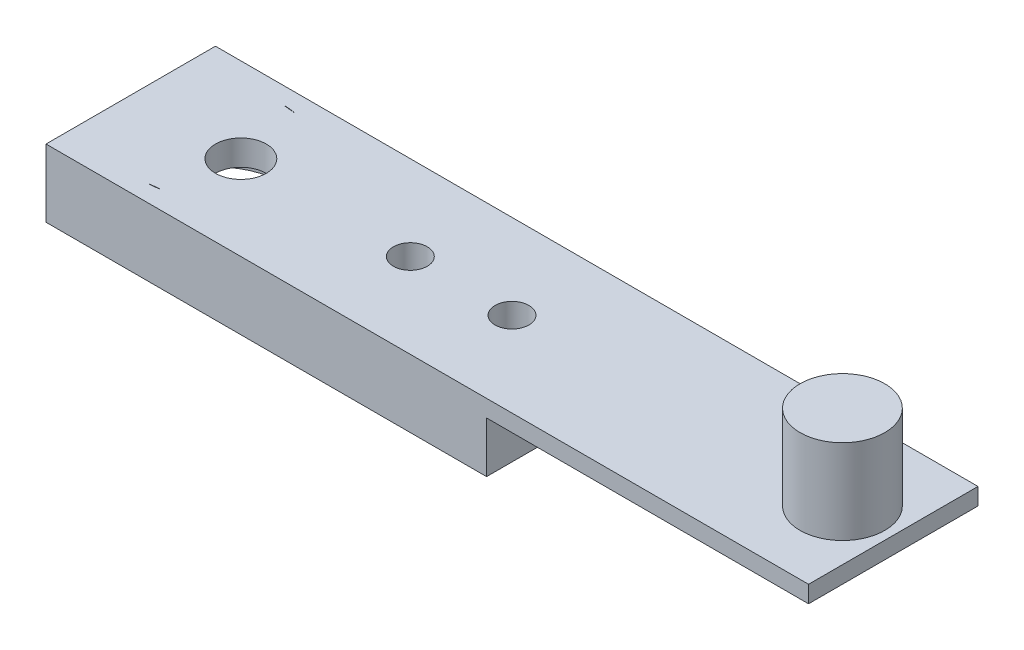
ISO-10303-21;
HEADER;
FILE_DESCRIPTION(('STEP AP214'),'2;1');
FILE_NAME('part.step','',(''),(''),'','','');
FILE_SCHEMA(('AUTOMOTIVE_DESIGN { 1 0 10303 214 1 1 1 1 }'));
ENDSEC;
DATA;
#1=APPLICATION_CONTEXT('core data for automotive mechanical design processes');
#2=APPLICATION_PROTOCOL_DEFINITION('international standard','automotive_design',2000,#1);
#3=PRODUCT_CONTEXT('',#1,'mechanical');
#4=PRODUCT('Part','Part','',(#3));
#5=PRODUCT_RELATED_PRODUCT_CATEGORY('part','',(#4));
#6=PRODUCT_DEFINITION_FORMATION('','',#4);
#7=PRODUCT_DEFINITION_CONTEXT('part definition',#1,'design');
#8=PRODUCT_DEFINITION('design','',#6,#7);
#9=PRODUCT_DEFINITION_SHAPE('','',#8);
#10=(LENGTH_UNIT() NAMED_UNIT(*) SI_UNIT(.MILLI.,.METRE.));
#11=(NAMED_UNIT(*) PLANE_ANGLE_UNIT() SI_UNIT($,.RADIAN.));
#12=(NAMED_UNIT(*) SI_UNIT($,.STERADIAN.) SOLID_ANGLE_UNIT());
#13=UNCERTAINTY_MEASURE_WITH_UNIT(LENGTH_MEASURE(1.E-05),#10,'distance_accuracy_value','');
#14=(GEOMETRIC_REPRESENTATION_CONTEXT(3) GLOBAL_UNCERTAINTY_ASSIGNED_CONTEXT((#13)) GLOBAL_UNIT_ASSIGNED_CONTEXT((#10,
#11,#12)) REPRESENTATION_CONTEXT('',''));
#15=CARTESIAN_POINT('',(0.,0.,0.));
#16=DIRECTION('',(0.,0.,1.));
#17=DIRECTION('',(1.,0.,0.));
#18=AXIS2_PLACEMENT_3D('',#15,#16,#17);
#19=CARTESIAN_POINT('',(42.,3.,-5.00000000000001));
#20=DIRECTION('',(0.,1.,0.));
#21=DIRECTION('',(0.,0.,1.));
#22=AXIS2_PLACEMENT_3D('',#19,#20,#21);
#23=CYLINDRICAL_SURFACE('',#22,2.5);
#24=CARTESIAN_POINT('',(42.,9.,-5.00000000000001));
#25=DIRECTION('',(0.,1.,0.));
#26=DIRECTION('',(0.,0.,1.));
#27=AXIS2_PLACEMENT_3D('',#24,#25,#26);
#28=CIRCLE('',#27,2.5);
#29=CARTESIAN_POINT('',(42.,9.,-2.5));
#30=VERTEX_POINT('',#29);
#31=EDGE_CURVE('E12',#30,#30,#28,.T.);
#32=ORIENTED_EDGE('',*,*,#31,.F.);
#33=EDGE_LOOP('',(#32));
#34=FACE_BOUND('',#33,.T.);
#35=CARTESIAN_POINT('',(42.,4.,-5.00000000000001));
#36=DIRECTION('',(0.,1.,0.));
#37=DIRECTION('',(0.,0.,1.));
#38=AXIS2_PLACEMENT_3D('',#35,#36,#37);
#39=CIRCLE('',#38,2.5);
#40=CARTESIAN_POINT('',(42.,4.,-2.5));
#41=VERTEX_POINT('',#40);
#42=EDGE_CURVE('E124',#41,#41,#39,.T.);
#43=ORIENTED_EDGE('',*,*,#42,.T.);
#44=EDGE_LOOP('',(#43));
#45=FACE_BOUND('',#44,.T.);
#46=ADVANCED_FACE('F54',(#34,#45),#23,.T.);
#47=CARTESIAN_POINT('',(42.,9.,-5.00000000000001));
#48=DIRECTION('',(0.,1.,0.));
#49=DIRECTION('',(0.,0.,1.));
#50=AXIS2_PLACEMENT_3D('',#47,#48,#49);
#51=PLANE('',#50);
#52=ORIENTED_EDGE('',*,*,#31,.T.);
#53=EDGE_LOOP('',(#52));
#54=FACE_BOUND('',#53,.T.);
#55=ADVANCED_FACE('F277',(#54),#51,.T.);
#56=CARTESIAN_POINT('',(45.,3.,0.));
#57=DIRECTION('',(-1.,0.,0.));
#58=DIRECTION('',(0.,0.,1.));
#59=AXIS2_PLACEMENT_3D('',#56,#57,#58);
#60=PLANE('',#59);
#61=DIRECTION('',(0.,0.,1.));
#62=VECTOR('',#61,1.);
#63=CARTESIAN_POINT('',(45.,4.,0.));
#64=LINE('',#63,#62);
#65=CARTESIAN_POINT('',(45.,4.,-10.));
#66=VERTEX_POINT('',#65);
#67=CARTESIAN_POINT('',(45.,4.,0.));
#68=VERTEX_POINT('',#67);
#69=EDGE_CURVE('E117',#66,#68,#64,.T.);
#70=ORIENTED_EDGE('',*,*,#69,.T.);
#71=DIRECTION('',(0.,1.,0.));
#72=VECTOR('',#71,1.);
#73=CARTESIAN_POINT('',(45.,3.,0.));
#74=LINE('',#73,#72);
#75=CARTESIAN_POINT('',(45.,3.,0.));
#76=VERTEX_POINT('',#75);
#77=EDGE_CURVE('E62',#76,#68,#74,.T.);
#78=ORIENTED_EDGE('',*,*,#77,.F.);
#79=DIRECTION('',(0.,0.,1.));
#80=VECTOR('',#79,1.);
#81=CARTESIAN_POINT('',(45.,3.,0.));
#82=LINE('',#81,#80);
#83=CARTESIAN_POINT('',(45.,3.,-10.));
#84=VERTEX_POINT('',#83);
#85=EDGE_CURVE('E108',#84,#76,#82,.T.);
#86=ORIENTED_EDGE('',*,*,#85,.F.);
#87=DIRECTION('',(0.,1.,0.));
#88=VECTOR('',#87,1.);
#89=CARTESIAN_POINT('',(45.,3.,-10.));
#90=LINE('',#89,#88);
#91=EDGE_CURVE('E70',#84,#66,#90,.T.);
#92=ORIENTED_EDGE('',*,*,#91,.T.);
#93=EDGE_LOOP('',(#70,#78,#86,#92));
#94=FACE_BOUND('',#93,.T.);
#95=ADVANCED_FACE('F116',(#94),#60,.F.);
#96=CARTESIAN_POINT('',(0.,3.,0.));
#97=DIRECTION('',(0.,0.,-1.));
#98=DIRECTION('',(-1.,0.,0.));
#99=AXIS2_PLACEMENT_3D('',#96,#97,#98);
#100=PLANE('',#99);
#101=DIRECTION('',(-1.,0.,0.));
#102=VECTOR('',#101,1.);
#103=CARTESIAN_POINT('',(0.,4.,0.));
#104=LINE('',#103,#102);
#105=CARTESIAN_POINT('',(0.,4.,0.));
#106=VERTEX_POINT('',#105);
#107=EDGE_CURVE('E83',#68,#106,#104,.T.);
#108=ORIENTED_EDGE('',*,*,#107,.T.);
#109=DIRECTION('',(0.,-1.,0.));
#110=VECTOR('',#109,1.);
#111=CARTESIAN_POINT('',(0.,4.,0.));
#112=LINE('',#111,#110);
#113=CARTESIAN_POINT('',(0.,0.,0.));
#114=VERTEX_POINT('',#113);
#115=EDGE_CURVE('E148',#106,#114,#112,.T.);
#116=ORIENTED_EDGE('',*,*,#115,.T.);
#117=DIRECTION('',(1.,0.,0.));
#118=VECTOR('',#117,1.);
#119=CARTESIAN_POINT('',(0.,0.,0.));
#120=LINE('',#119,#118);
#121=CARTESIAN_POINT('',(26.,0.,0.));
#122=VERTEX_POINT('',#121);
#123=EDGE_CURVE('E152',#114,#122,#120,.T.);
#124=ORIENTED_EDGE('',*,*,#123,.T.);
#125=DIRECTION('',(0.,-1.,0.));
#126=VECTOR('',#125,1.);
#127=CARTESIAN_POINT('',(26.,4.,0.));
#128=LINE('',#127,#126);
#129=CARTESIAN_POINT('',(26.,3.,0.));
#130=VERTEX_POINT('',#129);
#131=EDGE_CURVE('E106',#130,#122,#128,.T.);
#132=ORIENTED_EDGE('',*,*,#131,.F.);
#133=DIRECTION('',(-1.,0.,0.));
#134=VECTOR('',#133,1.);
#135=CARTESIAN_POINT('',(0.,3.,0.));
#136=LINE('',#135,#134);
#137=EDGE_CURVE('E100',#76,#130,#136,.T.);
#138=ORIENTED_EDGE('',*,*,#137,.F.);
#139=ORIENTED_EDGE('',*,*,#77,.T.);
#140=EDGE_LOOP('',(#108,#116,#124,#132,#138,#139));
#141=FACE_BOUND('',#140,.T.);
#142=ADVANCED_FACE('F102',(#141),#100,.F.);
#143=CARTESIAN_POINT('',(0.,3.,-10.));
#144=DIRECTION('',(0.,0.,-1.));
#145=DIRECTION('',(-1.,0.,0.));
#146=AXIS2_PLACEMENT_3D('',#143,#144,#145);
#147=PLANE('',#146);
#148=DIRECTION('',(-1.,0.,0.));
#149=VECTOR('',#148,1.);
#150=CARTESIAN_POINT('',(0.,4.,-10.));
#151=LINE('',#150,#149);
#152=CARTESIAN_POINT('',(0.,4.,-10.));
#153=VERTEX_POINT('',#152);
#154=EDGE_CURVE('E114',#66,#153,#151,.T.);
#155=ORIENTED_EDGE('',*,*,#154,.F.);
#156=ORIENTED_EDGE('',*,*,#91,.F.);
#157=DIRECTION('',(-1.,0.,0.));
#158=VECTOR('',#157,1.);
#159=CARTESIAN_POINT('',(0.,3.,-10.));
#160=LINE('',#159,#158);
#161=CARTESIAN_POINT('',(26.,3.,-10.));
#162=VERTEX_POINT('',#161);
#163=EDGE_CURVE('E112',#84,#162,#160,.T.);
#164=ORIENTED_EDGE('',*,*,#163,.T.);
#165=DIRECTION('',(0.,-1.,0.));
#166=VECTOR('',#165,1.);
#167=CARTESIAN_POINT('',(26.,4.,-10.));
#168=LINE('',#167,#166);
#169=CARTESIAN_POINT('',(26.,0.,-10.));
#170=VERTEX_POINT('',#169);
#171=EDGE_CURVE('E129',#162,#170,#168,.T.);
#172=ORIENTED_EDGE('',*,*,#171,.T.);
#173=DIRECTION('',(1.,0.,0.));
#174=VECTOR('',#173,1.);
#175=CARTESIAN_POINT('',(0.,0.,-10.));
#176=LINE('',#175,#174);
#177=CARTESIAN_POINT('',(0.,0.,-10.));
#178=VERTEX_POINT('',#177);
#179=EDGE_CURVE('E158',#178,#170,#176,.T.);
#180=ORIENTED_EDGE('',*,*,#179,.F.);
#181=DIRECTION('',(0.,-1.,0.));
#182=VECTOR('',#181,1.);
#183=CARTESIAN_POINT('',(0.,4.,-10.));
#184=LINE('',#183,#182);
#185=EDGE_CURVE('E145',#153,#178,#184,.T.);
#186=ORIENTED_EDGE('',*,*,#185,.F.);
#187=EDGE_LOOP('',(#155,#156,#164,#172,#180,#186));
#188=FACE_BOUND('',#187,.T.);
#189=ADVANCED_FACE('F246',(#188),#147,.T.);
#190=CARTESIAN_POINT('',(0.,4.,0.));
#191=DIRECTION('',(0.,-1.,0.));
#192=DIRECTION('',(0.,0.,-1.));
#193=AXIS2_PLACEMENT_3D('',#190,#191,#192);
#194=PLANE('',#193);
#195=ORIENTED_EDGE('',*,*,#42,.F.);
#196=EDGE_LOOP('',(#195));
#197=FACE_BOUND('',#196,.T.);
#198=ORIENTED_EDGE('',*,*,#69,.F.);
#199=ORIENTED_EDGE('',*,*,#154,.T.);
#200=DIRECTION('',(0.,0.,-1.));
#201=VECTOR('',#200,1.);
#202=CARTESIAN_POINT('',(0.,4.,0.));
#203=LINE('',#202,#201);
#204=EDGE_CURVE('E173',#106,#153,#203,.T.);
#205=ORIENTED_EDGE('',*,*,#204,.F.);
#206=ORIENTED_EDGE('',*,*,#107,.F.);
#207=EDGE_LOOP('',(#198,#199,#205,#206));
#208=FACE_BOUND('',#207,.T.);
#209=CARTESIAN_POINT('',(6.5,4.,-5.));
#210=DIRECTION('',(0.,1.,0.));
#211=DIRECTION('',(0.,0.,1.));
#212=AXIS2_PLACEMENT_3D('',#209,#210,#211);
#213=CIRCLE('',#212,1.5);
#214=CARTESIAN_POINT('',(6.5,4.,-3.5));
#215=VERTEX_POINT('',#214);
#216=EDGE_CURVE('E154',#215,#215,#213,.T.);
#217=ORIENTED_EDGE('',*,*,#216,.F.);
#218=EDGE_LOOP('',(#217));
#219=FACE_BOUND('',#218,.T.);
#220=DIRECTION('',(-0.995037190209989,0.,-0.0995037190209989));
#221=VECTOR('',#220,1.);
#222=CARTESIAN_POINT('',(0.940594059405941,4.,-9.40594059405941));
#223=LINE('',#222,#221);
#224=CARTESIAN_POINT('',(5.7920792079208,4.,-8.92079207920792));
#225=VERTEX_POINT('',#224);
#226=CARTESIAN_POINT('',(5.,4.,-9.));
#227=VERTEX_POINT('',#226);
#228=EDGE_CURVE('E183',#225,#227,#223,.T.);
#229=ORIENTED_EDGE('',*,*,#228,.T.);
#230=CARTESIAN_POINT('',(5.,4.,-5.));
#231=DIRECTION('',(0.,1.,0.));
#232=DIRECTION('',(0.,0.,1.));
#233=AXIS2_PLACEMENT_3D('',#230,#231,#232);
#234=CIRCLE('',#233,4.);
#235=EDGE_CURVE('E180',#225,#227,#234,.T.);
#236=ORIENTED_EDGE('',*,*,#235,.F.);
#237=EDGE_LOOP('',(#229,#236));
#238=FACE_BOUND('',#237,.T.);
#239=CARTESIAN_POINT('',(5.,4.,-1.));
#240=VERTEX_POINT('',#239);
#241=CARTESIAN_POINT('',(5.79207920792082,4.,-1.07920792079208));
#242=VERTEX_POINT('',#241);
#243=EDGE_CURVE('E179',#240,#242,#234,.T.);
#244=ORIENTED_EDGE('',*,*,#243,.F.);
#245=DIRECTION('',(-0.995037190209989,0.,0.0995037190209992));
#246=VECTOR('',#245,1.);
#247=CARTESIAN_POINT('',(-0.0495049504950496,4.,-0.495049504950495));
#248=LINE('',#247,#246);
#249=EDGE_CURVE('E176',#242,#240,#248,.T.);
#250=ORIENTED_EDGE('',*,*,#249,.F.);
#251=EDGE_LOOP('',(#244,#250));
#252=FACE_BOUND('',#251,.T.);
#253=CARTESIAN_POINT('',(16.5,4.,-5.));
#254=DIRECTION('',(0.,1.,0.));
#255=DIRECTION('',(0.,0.,1.));
#256=AXIS2_PLACEMENT_3D('',#253,#254,#255);
#257=CIRCLE('',#256,1.);
#258=CARTESIAN_POINT('',(16.5,4.,-4.));
#259=VERTEX_POINT('',#258);
#260=EDGE_CURVE('E170',#259,#259,#257,.T.);
#261=ORIENTED_EDGE('',*,*,#260,.F.);
#262=EDGE_LOOP('',(#261));
#263=FACE_BOUND('',#262,.T.);
#264=CARTESIAN_POINT('',(22.5,4.,-5.));
#265=DIRECTION('',(0.,1.,0.));
#266=DIRECTION('',(0.,0.,1.));
#267=AXIS2_PLACEMENT_3D('',#264,#265,#266);
#268=CIRCLE('',#267,1.);
#269=CARTESIAN_POINT('',(22.5,4.,-4.));
#270=VERTEX_POINT('',#269);
#271=EDGE_CURVE('E137',#270,#270,#268,.T.);
#272=ORIENTED_EDGE('',*,*,#271,.F.);
#273=EDGE_LOOP('',(#272));
#274=FACE_BOUND('',#273,.T.);
#275=ADVANCED_FACE('F243',(#197,#208,#219,#238,#252,#263,#274),#194,.F.);
#276=CARTESIAN_POINT('',(42.,3.,-5.00000000000001));
#277=DIRECTION('',(0.,1.,0.));
#278=DIRECTION('',(0.,0.,1.));
#279=AXIS2_PLACEMENT_3D('',#276,#277,#278);
#280=PLANE('',#279);
#281=ORIENTED_EDGE('',*,*,#85,.T.);
#282=ORIENTED_EDGE('',*,*,#137,.T.);
#283=DIRECTION('',(0.,0.,-1.));
#284=VECTOR('',#283,1.);
#285=CARTESIAN_POINT('',(26.,3.,0.));
#286=LINE('',#285,#284);
#287=EDGE_CURVE('E91',#130,#162,#286,.T.);
#288=ORIENTED_EDGE('',*,*,#287,.T.);
#289=ORIENTED_EDGE('',*,*,#163,.F.);
#290=EDGE_LOOP('',(#281,#282,#288,#289));
#291=FACE_BOUND('',#290,.T.);
#292=ADVANCED_FACE('F111',(#291),#280,.F.);
#293=CARTESIAN_POINT('',(26.,4.,0.));
#294=DIRECTION('',(1.,0.,0.));
#295=DIRECTION('',(0.,0.,-1.));
#296=AXIS2_PLACEMENT_3D('',#293,#294,#295);
#297=PLANE('',#296);
#298=ORIENTED_EDGE('',*,*,#287,.F.);
#299=ORIENTED_EDGE('',*,*,#131,.T.);
#300=DIRECTION('',(0.,0.,1.));
#301=VECTOR('',#300,1.);
#302=CARTESIAN_POINT('',(26.,0.,0.));
#303=LINE('',#302,#301);
#304=EDGE_CURVE('E161',#170,#122,#303,.T.);
#305=ORIENTED_EDGE('',*,*,#304,.F.);
#306=ORIENTED_EDGE('',*,*,#171,.F.);
#307=EDGE_LOOP('',(#298,#299,#305,#306));
#308=FACE_BOUND('',#307,.T.);
#309=ADVANCED_FACE('F366',(#308),#297,.T.);
#310=CARTESIAN_POINT('',(0.,0.,0.));
#311=DIRECTION('',(0.,1.,0.));
#312=DIRECTION('',(0.,0.,1.));
#313=AXIS2_PLACEMENT_3D('',#310,#311,#312);
#314=PLANE('',#313);
#315=ORIENTED_EDGE('',*,*,#304,.T.);
#316=ORIENTED_EDGE('',*,*,#123,.F.);
#317=DIRECTION('',(0.,0.,-1.));
#318=VECTOR('',#317,1.);
#319=CARTESIAN_POINT('',(0.,0.,0.));
#320=LINE('',#319,#318);
#321=EDGE_CURVE('E155',#114,#178,#320,.T.);
#322=ORIENTED_EDGE('',*,*,#321,.T.);
#323=ORIENTED_EDGE('',*,*,#179,.T.);
#324=EDGE_LOOP('',(#315,#316,#322,#323));
#325=FACE_BOUND('',#324,.T.);
#326=DIRECTION('',(-0.995037190209989,0.,-0.0995037190209989));
#327=VECTOR('',#326,1.);
#328=CARTESIAN_POINT('',(0.940594059405941,0.,-9.40594059405941));
#329=LINE('',#328,#327);
#330=CARTESIAN_POINT('',(25.,0.,-7.));
#331=VERTEX_POINT('',#330);
#332=CARTESIAN_POINT('',(5.79207920792078,0.,-8.92079207920792));
#333=VERTEX_POINT('',#332);
#334=EDGE_CURVE('E207',#331,#333,#329,.T.);
#335=ORIENTED_EDGE('',*,*,#334,.T.);
#336=CARTESIAN_POINT('',(5.,0.,-5.));
#337=DIRECTION('',(0.,1.,0.));
#338=DIRECTION('',(0.,0.,1.));
#339=AXIS2_PLACEMENT_3D('',#336,#337,#338);
#340=CIRCLE('',#339,4.);
#341=CARTESIAN_POINT('',(5.79207920792082,0.,-1.07920792079208));
#342=VERTEX_POINT('',#341);
#343=EDGE_CURVE('E164',#333,#342,#340,.T.);
#344=ORIENTED_EDGE('',*,*,#343,.T.);
#345=DIRECTION('',(-0.995037190209989,0.,0.0995037190209992));
#346=VECTOR('',#345,1.);
#347=CARTESIAN_POINT('',(-0.0495049504950496,0.,-0.495049504950495));
#348=LINE('',#347,#346);
#349=CARTESIAN_POINT('',(25.,0.,-3.00000000000001));
#350=VERTEX_POINT('',#349);
#351=EDGE_CURVE('E204',#350,#342,#348,.T.);
#352=ORIENTED_EDGE('',*,*,#351,.F.);
#353=DIRECTION('',(0.,0.,1.));
#354=VECTOR('',#353,1.);
#355=CARTESIAN_POINT('',(25.,0.,0.));
#356=LINE('',#355,#354);
#357=EDGE_CURVE('E200',#331,#350,#356,.T.);
#358=ORIENTED_EDGE('',*,*,#357,.F.);
#359=EDGE_LOOP('',(#335,#344,#352,#358));
#360=FACE_BOUND('',#359,.T.);
#361=ADVANCED_FACE('F370',(#325,#360),#314,.F.);
#362=CARTESIAN_POINT('',(0.,4.,0.));
#363=DIRECTION('',(-1.,0.,0.));
#364=DIRECTION('',(0.,0.,1.));
#365=AXIS2_PLACEMENT_3D('',#362,#363,#364);
#366=PLANE('',#365);
#367=ORIENTED_EDGE('',*,*,#321,.F.);
#368=ORIENTED_EDGE('',*,*,#115,.F.);
#369=ORIENTED_EDGE('',*,*,#204,.T.);
#370=ORIENTED_EDGE('',*,*,#185,.T.);
#371=EDGE_LOOP('',(#367,#368,#369,#370));
#372=FACE_BOUND('',#371,.T.);
#373=ADVANCED_FACE('F296',(#372),#366,.T.);
#374=CARTESIAN_POINT('',(5.,4.,-5.));
#375=DIRECTION('',(0.,-1.,0.));
#376=DIRECTION('',(0.,0.,-1.));
#377=AXIS2_PLACEMENT_3D('',#374,#375,#376);
#378=CYLINDRICAL_SURFACE('',#377,4.);
#379=ORIENTED_EDGE('',*,*,#343,.F.);
#380=DIRECTION('',(0.,-1.,0.));
#381=VECTOR('',#380,1.);
#382=CARTESIAN_POINT('',(5.79207920792081,4.,-8.92079207920792));
#383=LINE('',#382,#381);
#384=CARTESIAN_POINT('',(5.7920792079208,2.5,-8.92079207920792));
#385=VERTEX_POINT('',#384);
#386=EDGE_CURVE('E167',#333,#385,#383,.F.);
#387=ORIENTED_EDGE('',*,*,#386,.T.);
#388=DIRECTION('',(0.,-1.,0.));
#389=VECTOR('',#388,1.);
#390=CARTESIAN_POINT('',(5.7920792079208,4.,-8.92079207920792));
#391=LINE('',#390,#389);
#392=EDGE_CURVE('E134',#225,#385,#391,.T.);
#393=ORIENTED_EDGE('',*,*,#392,.F.);
#394=ORIENTED_EDGE('',*,*,#235,.T.);
#395=DIRECTION('',(0.,-1.,0.));
#396=VECTOR('',#395,1.);
#397=CARTESIAN_POINT('',(5.,4.,-9.));
#398=LINE('',#397,#396);
#399=CARTESIAN_POINT('',(5.,2.5,-9.));
#400=VERTEX_POINT('',#399);
#401=EDGE_CURVE('E130',#227,#400,#398,.T.);
#402=ORIENTED_EDGE('',*,*,#401,.T.);
#403=CARTESIAN_POINT('',(5.,2.5,-5.));
#404=DIRECTION('',(0.,1.,0.));
#405=DIRECTION('',(0.,0.,1.));
#406=AXIS2_PLACEMENT_3D('',#403,#404,#405);
#407=CIRCLE('',#406,4.);
#408=CARTESIAN_POINT('',(5.,2.5,-1.));
#409=VERTEX_POINT('',#408);
#410=EDGE_CURVE('E216',#400,#409,#407,.T.);
#411=ORIENTED_EDGE('',*,*,#410,.T.);
#412=DIRECTION('',(0.,-1.,0.));
#413=VECTOR('',#412,1.);
#414=CARTESIAN_POINT('',(5.,4.,-1.));
#415=LINE('',#414,#413);
#416=EDGE_CURVE('E138',#240,#409,#415,.T.);
#417=ORIENTED_EDGE('',*,*,#416,.F.);
#418=ORIENTED_EDGE('',*,*,#243,.T.);
#419=DIRECTION('',(0.,-1.,0.));
#420=VECTOR('',#419,1.);
#421=CARTESIAN_POINT('',(5.79207920792082,4.,-1.07920792079208));
#422=LINE('',#421,#420);
#423=CARTESIAN_POINT('',(5.79207920792082,2.5,-1.07920792079208));
#424=VERTEX_POINT('',#423);
#425=EDGE_CURVE('E133',#242,#424,#422,.T.);
#426=ORIENTED_EDGE('',*,*,#425,.T.);
#427=DIRECTION('',(0.,-1.,0.));
#428=VECTOR('',#427,1.);
#429=CARTESIAN_POINT('',(5.79207920792082,4.,-1.07920792079208));
#430=LINE('',#429,#428);
#431=EDGE_CURVE('E190',#342,#424,#430,.F.);
#432=ORIENTED_EDGE('',*,*,#431,.F.);
#433=EDGE_LOOP('',(#379,#387,#393,#394,#402,#411,#417,#418,#426,#432));
#434=FACE_BOUND('',#433,.T.);
#435=ADVANCED_FACE('F323',(#434),#378,.F.);
#436=CARTESIAN_POINT('',(0.940594059405941,4.,-9.40594059405941));
#437=DIRECTION('',(-0.0995037190209989,0.,0.995037190209989));
#438=DIRECTION('',(0.995037190209989,0.,0.099503719020999));
#439=AXIS2_PLACEMENT_3D('',#436,#437,#438);
#440=PLANE('',#439);
#441=ORIENTED_EDGE('',*,*,#392,.T.);
#442=DIRECTION('',(-0.995037190209989,0.,-0.0995037190209989));
#443=VECTOR('',#442,1.);
#444=CARTESIAN_POINT('',(0.940594059405941,2.5,-9.40594059405941));
#445=LINE('',#444,#443);
#446=EDGE_CURVE('E222',#385,#400,#445,.T.);
#447=ORIENTED_EDGE('',*,*,#446,.T.);
#448=ORIENTED_EDGE('',*,*,#401,.F.);
#449=ORIENTED_EDGE('',*,*,#228,.F.);
#450=EDGE_LOOP('',(#441,#447,#448,#449));
#451=FACE_BOUND('',#450,.T.);
#452=ADVANCED_FACE('F348',(#451),#440,.F.);
#453=CARTESIAN_POINT('',(16.5,4.,-5.));
#454=DIRECTION('',(0.,-1.,0.));
#455=DIRECTION('',(0.,0.,-1.));
#456=AXIS2_PLACEMENT_3D('',#453,#454,#455);
#457=CYLINDRICAL_SURFACE('',#456,1.);
#458=CARTESIAN_POINT('',(16.5,2.5,-5.));
#459=DIRECTION('',(0.,1.,0.));
#460=DIRECTION('',(0.,0.,1.));
#461=AXIS2_PLACEMENT_3D('',#458,#459,#460);
#462=CIRCLE('',#461,1.);
#463=CARTESIAN_POINT('',(16.5,2.5,-4.));
#464=VERTEX_POINT('',#463);
#465=EDGE_CURVE('E226',#464,#464,#462,.T.);
#466=ORIENTED_EDGE('',*,*,#465,.F.);
#467=EDGE_LOOP('',(#466));
#468=FACE_BOUND('',#467,.T.);
#469=ORIENTED_EDGE('',*,*,#260,.T.);
#470=EDGE_LOOP('',(#469));
#471=FACE_BOUND('',#470,.T.);
#472=ADVANCED_FACE('F350',(#468,#471),#457,.F.);
#473=CARTESIAN_POINT('',(-0.0495049504950496,4.,-0.495049504950495));
#474=DIRECTION('',(0.0995037190209992,0.,0.995037190209989));
#475=DIRECTION('',(0.995037190209989,0.,-0.0995037190209992));
#476=AXIS2_PLACEMENT_3D('',#473,#474,#475);
#477=PLANE('',#476);
#478=DIRECTION('',(-0.995037190209989,0.,0.0995037190209992));
#479=VECTOR('',#478,1.);
#480=CARTESIAN_POINT('',(-0.0495049504950496,2.5,-0.495049504950495));
#481=LINE('',#480,#479);
#482=EDGE_CURVE('E215',#424,#409,#481,.T.);
#483=ORIENTED_EDGE('',*,*,#482,.F.);
#484=ORIENTED_EDGE('',*,*,#425,.F.);
#485=ORIENTED_EDGE('',*,*,#249,.T.);
#486=ORIENTED_EDGE('',*,*,#416,.T.);
#487=EDGE_LOOP('',(#483,#484,#485,#486));
#488=FACE_BOUND('',#487,.T.);
#489=ADVANCED_FACE('F239',(#488),#477,.T.);
#490=CARTESIAN_POINT('',(6.5,4.,-5.));
#491=DIRECTION('',(0.,-1.,0.));
#492=DIRECTION('',(0.,0.,-1.));
#493=AXIS2_PLACEMENT_3D('',#490,#491,#492);
#494=CYLINDRICAL_SURFACE('',#493,1.5);
#495=CARTESIAN_POINT('',(6.5,2.5,-5.));
#496=DIRECTION('',(0.,1.,0.));
#497=DIRECTION('',(0.,0.,1.));
#498=AXIS2_PLACEMENT_3D('',#495,#496,#497);
#499=CIRCLE('',#498,1.5);
#500=CARTESIAN_POINT('',(6.5,2.5,-3.5));
#501=VERTEX_POINT('',#500);
#502=EDGE_CURVE('E203',#501,#501,#499,.T.);
#503=ORIENTED_EDGE('',*,*,#502,.F.);
#504=EDGE_LOOP('',(#503));
#505=FACE_BOUND('',#504,.T.);
#506=ORIENTED_EDGE('',*,*,#216,.T.);
#507=EDGE_LOOP('',(#506));
#508=FACE_BOUND('',#507,.T.);
#509=ADVANCED_FACE('F235',(#505,#508),#494,.F.);
#510=CARTESIAN_POINT('',(22.5,4.,-5.));
#511=DIRECTION('',(0.,-1.,0.));
#512=DIRECTION('',(0.,0.,-1.));
#513=AXIS2_PLACEMENT_3D('',#510,#511,#512);
#514=CYLINDRICAL_SURFACE('',#513,1.);
#515=CARTESIAN_POINT('',(22.5,2.5,-5.));
#516=DIRECTION('',(0.,1.,0.));
#517=DIRECTION('',(0.,0.,1.));
#518=AXIS2_PLACEMENT_3D('',#515,#516,#517);
#519=CIRCLE('',#518,1.);
#520=CARTESIAN_POINT('',(22.5,2.5,-4.));
#521=VERTEX_POINT('',#520);
#522=EDGE_CURVE('E223',#521,#521,#519,.T.);
#523=ORIENTED_EDGE('',*,*,#522,.F.);
#524=EDGE_LOOP('',(#523));
#525=FACE_BOUND('',#524,.T.);
#526=ORIENTED_EDGE('',*,*,#271,.T.);
#527=EDGE_LOOP('',(#526));
#528=FACE_BOUND('',#527,.T.);
#529=ADVANCED_FACE('F238',(#525,#528),#514,.F.);
#530=CARTESIAN_POINT('',(0.940594059405941,2.5,-9.40594059405941));
#531=DIRECTION('',(-0.0995037190209989,0.,0.995037190209989));
#532=DIRECTION('',(0.995037190209989,0.,0.0995037190209989));
#533=AXIS2_PLACEMENT_3D('',#530,#531,#532);
#534=PLANE('',#533);
#535=ORIENTED_EDGE('',*,*,#334,.F.);
#536=DIRECTION('',(0.,-1.,0.));
#537=VECTOR('',#536,1.);
#538=CARTESIAN_POINT('',(25.,2.5,-7.));
#539=LINE('',#538,#537);
#540=CARTESIAN_POINT('',(25.,2.5,-7.));
#541=VERTEX_POINT('',#540);
#542=EDGE_CURVE('E196',#541,#331,#539,.T.);
#543=ORIENTED_EDGE('',*,*,#542,.F.);
#544=EDGE_CURVE('E219',#541,#385,#445,.T.);
#545=ORIENTED_EDGE('',*,*,#544,.T.);
#546=ORIENTED_EDGE('',*,*,#386,.F.);
#547=EDGE_LOOP('',(#535,#543,#545,#546));
#548=FACE_BOUND('',#547,.T.);
#549=ADVANCED_FACE('F264',(#548),#534,.T.);
#550=CARTESIAN_POINT('',(-0.0495049504950496,2.5,-0.495049504950495));
#551=DIRECTION('',(0.0995037190209992,0.,0.995037190209989));
#552=DIRECTION('',(0.995037190209989,0.,-0.0995037190209992));
#553=AXIS2_PLACEMENT_3D('',#550,#551,#552);
#554=PLANE('',#553);
#555=ORIENTED_EDGE('',*,*,#431,.T.);
#556=CARTESIAN_POINT('',(25.,2.5,-3.00000000000001));
#557=VERTEX_POINT('',#556);
#558=EDGE_CURVE('E212',#557,#424,#481,.T.);
#559=ORIENTED_EDGE('',*,*,#558,.F.);
#560=DIRECTION('',(0.,-1.,0.));
#561=VECTOR('',#560,1.);
#562=CARTESIAN_POINT('',(25.,2.5,-3.00000000000001));
#563=LINE('',#562,#561);
#564=EDGE_CURVE('E193',#557,#350,#563,.T.);
#565=ORIENTED_EDGE('',*,*,#564,.T.);
#566=ORIENTED_EDGE('',*,*,#351,.T.);
#567=EDGE_LOOP('',(#555,#559,#565,#566));
#568=FACE_BOUND('',#567,.T.);
#569=ADVANCED_FACE('F270',(#568),#554,.F.);
#570=CARTESIAN_POINT('',(25.,2.5,0.));
#571=DIRECTION('',(1.,0.,0.));
#572=DIRECTION('',(0.,0.,-1.));
#573=AXIS2_PLACEMENT_3D('',#570,#571,#572);
#574=PLANE('',#573);
#575=ORIENTED_EDGE('',*,*,#357,.T.);
#576=ORIENTED_EDGE('',*,*,#564,.F.);
#577=DIRECTION('',(0.,0.,1.));
#578=VECTOR('',#577,1.);
#579=CARTESIAN_POINT('',(25.,2.5,0.));
#580=LINE('',#579,#578);
#581=EDGE_CURVE('E199',#541,#557,#580,.T.);
#582=ORIENTED_EDGE('',*,*,#581,.F.);
#583=ORIENTED_EDGE('',*,*,#542,.T.);
#584=EDGE_LOOP('',(#575,#576,#582,#583));
#585=FACE_BOUND('',#584,.T.);
#586=ADVANCED_FACE('F405',(#585),#574,.F.);
#587=CARTESIAN_POINT('',(0.,2.5,0.));
#588=DIRECTION('',(0.,1.,0.));
#589=DIRECTION('',(0.,0.,1.));
#590=AXIS2_PLACEMENT_3D('',#587,#588,#589);
#591=PLANE('',#590);
#592=ORIENTED_EDGE('',*,*,#502,.T.);
#593=EDGE_LOOP('',(#592));
#594=FACE_BOUND('',#593,.T.);
#595=ORIENTED_EDGE('',*,*,#465,.T.);
#596=EDGE_LOOP('',(#595));
#597=FACE_BOUND('',#596,.T.);
#598=ORIENTED_EDGE('',*,*,#522,.T.);
#599=EDGE_LOOP('',(#598));
#600=FACE_BOUND('',#599,.T.);
#601=ORIENTED_EDGE('',*,*,#544,.F.);
#602=ORIENTED_EDGE('',*,*,#581,.T.);
#603=ORIENTED_EDGE('',*,*,#558,.T.);
#604=ORIENTED_EDGE('',*,*,#482,.T.);
#605=ORIENTED_EDGE('',*,*,#410,.F.);
#606=ORIENTED_EDGE('',*,*,#446,.F.);
#607=EDGE_LOOP('',(#601,#602,#603,#604,#605,#606));
#608=FACE_BOUND('',#607,.T.);
#609=ADVANCED_FACE('F232',(#594,#597,#600,#608),#591,.F.);
#610=CLOSED_SHELL('',(#46,#55,#95,#142,#189,#275,#292,#309,#361,#373,#435,#452,#472,#489,#509,
#529,#549,#569,#586,#609));
#611=MANIFOLD_SOLID_BREP('B2',#610);
#612=ADVANCED_BREP_SHAPE_REPRESENTATION('',(#18,#611),#14);
#613=SHAPE_DEFINITION_REPRESENTATION(#9,#612);
ENDSEC;
END-ISO-10303-21;
